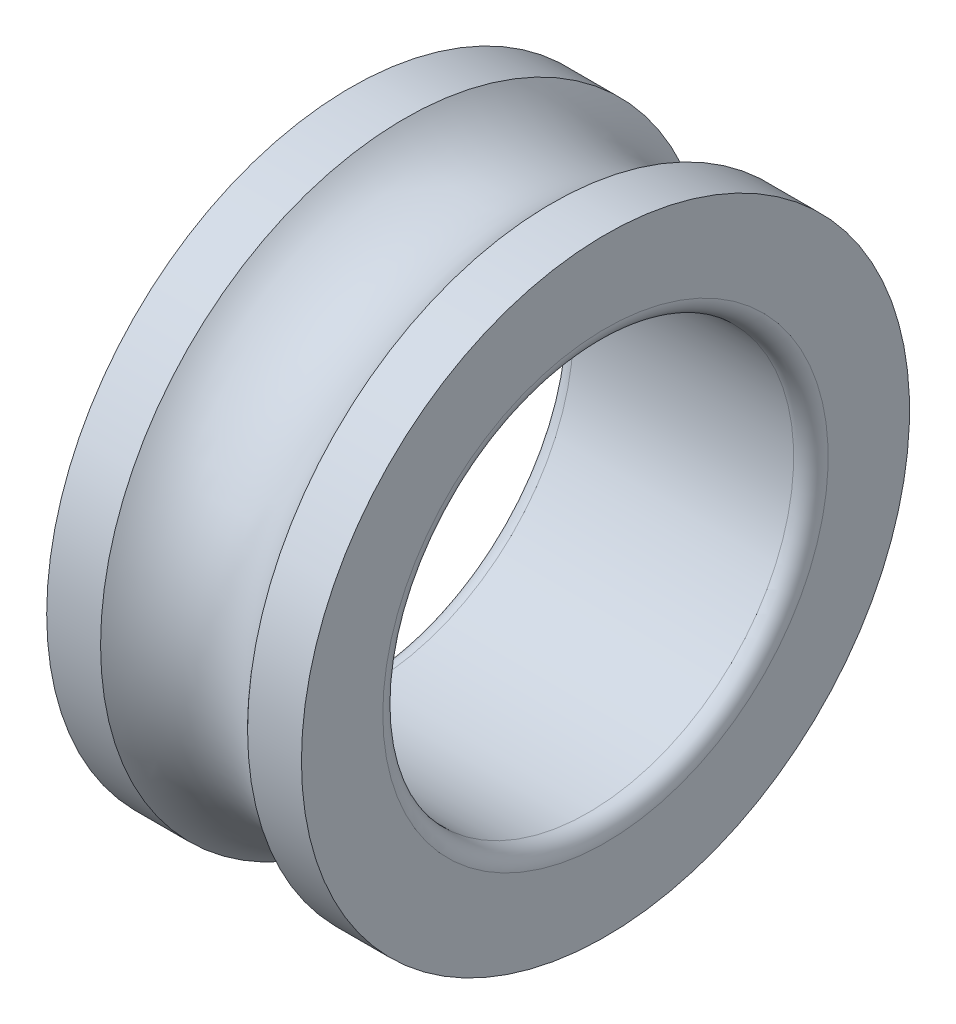
ISO-10303-21;
HEADER;
FILE_DESCRIPTION(('STEP AP214'),'2;1');
FILE_NAME('part.step','',(''),(''),'','','');
FILE_SCHEMA(('AUTOMOTIVE_DESIGN { 1 0 10303 214 1 1 1 1 }'));
ENDSEC;
DATA;
#1=APPLICATION_CONTEXT('core data for automotive mechanical design processes');
#2=APPLICATION_PROTOCOL_DEFINITION('international standard','automotive_design',2000,#1);
#3=PRODUCT_CONTEXT('',#1,'mechanical');
#4=PRODUCT('Part','Part','',(#3));
#5=PRODUCT_RELATED_PRODUCT_CATEGORY('part','',(#4));
#6=PRODUCT_DEFINITION_FORMATION('','',#4);
#7=PRODUCT_DEFINITION_CONTEXT('part definition',#1,'design');
#8=PRODUCT_DEFINITION('design','',#6,#7);
#9=PRODUCT_DEFINITION_SHAPE('','',#8);
#10=(LENGTH_UNIT() NAMED_UNIT(*) SI_UNIT(.MILLI.,.METRE.));
#11=(NAMED_UNIT(*) PLANE_ANGLE_UNIT() SI_UNIT($,.RADIAN.));
#12=(NAMED_UNIT(*) SI_UNIT($,.STERADIAN.) SOLID_ANGLE_UNIT());
#13=UNCERTAINTY_MEASURE_WITH_UNIT(LENGTH_MEASURE(1.E-05),#10,'distance_accuracy_value','');
#14=(GEOMETRIC_REPRESENTATION_CONTEXT(3) GLOBAL_UNCERTAINTY_ASSIGNED_CONTEXT((#13)) GLOBAL_UNIT_ASSIGNED_CONTEXT((#10,
#11,#12)) REPRESENTATION_CONTEXT('',''));
#15=CARTESIAN_POINT('',(0.,0.,0.));
#16=DIRECTION('',(0.,0.,1.));
#17=DIRECTION('',(1.,0.,0.));
#18=AXIS2_PLACEMENT_3D('',#15,#16,#17);
#19=CARTESIAN_POINT('',(-1.75058823529412,0.,0.));
#20=DIRECTION('',(-1.,0.,0.));
#21=DIRECTION('',(0.,0.,1.));
#22=AXIS2_PLACEMENT_3D('',#19,#20,#21);
#23=CYLINDRICAL_SURFACE('',#22,37.);
#24=CARTESIAN_POINT('',(-29.45,0.,0.));
#25=DIRECTION('',(-1.,0.,0.));
#26=DIRECTION('',(0.,0.,1.));
#27=AXIS2_PLACEMENT_3D('',#24,#25,#26);
#28=CIRCLE('',#27,37.);
#29=CARTESIAN_POINT('',(-29.45,0.,37.));
#30=VERTEX_POINT('',#29);
#31=EDGE_CURVE('E78',#30,#30,#28,.T.);
#32=ORIENTED_EDGE('',*,*,#31,.F.);
#33=EDGE_LOOP('',(#32));
#34=FACE_BOUND('',#33,.T.);
#35=CARTESIAN_POINT('',(-22.8942719099992,0.,0.));
#36=DIRECTION('',(-1.,0.,0.));
#37=DIRECTION('',(0.,0.,1.));
#38=AXIS2_PLACEMENT_3D('',#35,#36,#37);
#39=CIRCLE('',#38,37.);
#40=CARTESIAN_POINT('',(-22.8942719099992,0.,37.));
#41=VERTEX_POINT('',#40);
#42=EDGE_CURVE('E10',#41,#41,#39,.T.);
#43=ORIENTED_EDGE('',*,*,#42,.T.);
#44=EDGE_LOOP('',(#43));
#45=FACE_BOUND('',#44,.T.);
#46=ADVANCED_FACE('F43',(#34,#45),#23,.T.);
#47=CARTESIAN_POINT('',(-13.95,0.,0.));
#48=DIRECTION('',(-1.,0.,0.));
#49=DIRECTION('',(0.,0.,1.));
#50=AXIS2_PLACEMENT_3D('',#47,#48,#49);
#51=TOROIDAL_SURFACE('',#50,45.,12.);
#52=ORIENTED_EDGE('',*,*,#42,.F.);
#53=EDGE_LOOP('',(#52));
#54=FACE_BOUND('',#53,.T.);
#55=CARTESIAN_POINT('',(-5.00572809000085,0.,0.));
#56=DIRECTION('',(-1.,0.,0.));
#57=DIRECTION('',(0.,0.,1.));
#58=AXIS2_PLACEMENT_3D('',#55,#56,#57);
#59=CIRCLE('',#58,37.);
#60=CARTESIAN_POINT('',(-5.00572809000085,0.,37.));
#61=VERTEX_POINT('',#60);
#62=EDGE_CURVE('E50',#61,#61,#59,.T.);
#63=ORIENTED_EDGE('',*,*,#62,.T.);
#64=EDGE_LOOP('',(#63));
#65=FACE_BOUND('',#64,.T.);
#66=ADVANCED_FACE('F86',(#54,#65),#51,.F.);
#67=CARTESIAN_POINT('',(-1.75058823529412,0.,0.));
#68=DIRECTION('',(-1.,0.,0.));
#69=DIRECTION('',(0.,0.,1.));
#70=AXIS2_PLACEMENT_3D('',#67,#68,#69);
#71=CYLINDRICAL_SURFACE('',#70,37.);
#72=ORIENTED_EDGE('',*,*,#62,.F.);
#73=EDGE_LOOP('',(#72));
#74=FACE_BOUND('',#73,.T.);
#75=CARTESIAN_POINT('',(1.55,0.,0.));
#76=DIRECTION('',(-1.,0.,0.));
#77=DIRECTION('',(0.,0.,1.));
#78=AXIS2_PLACEMENT_3D('',#75,#76,#77);
#79=CIRCLE('',#78,37.);
#80=CARTESIAN_POINT('',(1.55,0.,37.));
#81=VERTEX_POINT('',#80);
#82=EDGE_CURVE('E55',#81,#81,#79,.T.);
#83=ORIENTED_EDGE('',*,*,#82,.T.);
#84=EDGE_LOOP('',(#83));
#85=FACE_BOUND('',#84,.T.);
#86=ADVANCED_FACE('F90',(#74,#85),#71,.T.);
#87=CARTESIAN_POINT('',(1.55,27.1,0.));
#88=DIRECTION('',(-1.,0.,0.));
#89=DIRECTION('',(0.,0.,1.));
#90=AXIS2_PLACEMENT_3D('',#87,#88,#89);
#91=PLANE('',#90);
#92=ORIENTED_EDGE('',*,*,#82,.F.);
#93=EDGE_LOOP('',(#92));
#94=FACE_BOUND('',#93,.T.);
#95=CARTESIAN_POINT('',(1.55,0.,0.));
#96=DIRECTION('',(-1.,0.,0.));
#97=DIRECTION('',(0.,0.,1.));
#98=AXIS2_PLACEMENT_3D('',#95,#96,#97);
#99=CIRCLE('',#98,27.1);
#100=CARTESIAN_POINT('',(1.55,0.,27.1));
#101=VERTEX_POINT('',#100);
#102=EDGE_CURVE('E60',#101,#101,#99,.T.);
#103=ORIENTED_EDGE('',*,*,#102,.T.);
#104=EDGE_LOOP('',(#103));
#105=FACE_BOUND('',#104,.T.);
#106=ADVANCED_FACE('F95',(#94,#105),#91,.F.);
#107=CARTESIAN_POINT('',(-0.55,0.,0.));
#108=DIRECTION('',(-1.,0.,0.));
#109=DIRECTION('',(0.,0.,1.));
#110=AXIS2_PLACEMENT_3D('',#107,#108,#109);
#111=TOROIDAL_SURFACE('',#110,27.1,2.1);
#112=ORIENTED_EDGE('',*,*,#102,.F.);
#113=EDGE_LOOP('',(#112));
#114=FACE_BOUND('',#113,.T.);
#115=CARTESIAN_POINT('',(-0.550000000000014,0.,0.));
#116=DIRECTION('',(-1.,0.,0.));
#117=DIRECTION('',(0.,0.,1.));
#118=AXIS2_PLACEMENT_3D('',#115,#116,#117);
#119=CIRCLE('',#118,25.);
#120=CARTESIAN_POINT('',(-0.550000000000014,0.,25.));
#121=VERTEX_POINT('',#120);
#122=EDGE_CURVE('E66',#121,#121,#119,.T.);
#123=ORIENTED_EDGE('',*,*,#122,.T.);
#124=EDGE_LOOP('',(#123));
#125=FACE_BOUND('',#124,.T.);
#126=ADVANCED_FACE('F101',(#114,#125),#111,.T.);
#127=CARTESIAN_POINT('',(-1.75058823529412,0.,0.));
#128=DIRECTION('',(-1.,0.,0.));
#129=DIRECTION('',(0.,0.,1.));
#130=AXIS2_PLACEMENT_3D('',#127,#128,#129);
#131=CYLINDRICAL_SURFACE('',#130,25.);
#132=ORIENTED_EDGE('',*,*,#122,.F.);
#133=EDGE_LOOP('',(#132));
#134=FACE_BOUND('',#133,.T.);
#135=CARTESIAN_POINT('',(-27.35,0.,0.));
#136=DIRECTION('',(-1.,0.,0.));
#137=DIRECTION('',(0.,0.,1.));
#138=AXIS2_PLACEMENT_3D('',#135,#136,#137);
#139=CIRCLE('',#138,25.);
#140=CARTESIAN_POINT('',(-27.35,0.,25.));
#141=VERTEX_POINT('',#140);
#142=EDGE_CURVE('E70',#141,#141,#139,.T.);
#143=ORIENTED_EDGE('',*,*,#142,.T.);
#144=EDGE_LOOP('',(#143));
#145=FACE_BOUND('',#144,.T.);
#146=ADVANCED_FACE('F105',(#134,#145),#131,.F.);
#147=CARTESIAN_POINT('',(-27.35,0.,0.));
#148=DIRECTION('',(-1.,0.,0.));
#149=DIRECTION('',(0.,0.,1.));
#150=AXIS2_PLACEMENT_3D('',#147,#148,#149);
#151=TOROIDAL_SURFACE('',#150,27.1,2.1);
#152=ORIENTED_EDGE('',*,*,#142,.F.);
#153=EDGE_LOOP('',(#152));
#154=FACE_BOUND('',#153,.T.);
#155=CARTESIAN_POINT('',(-29.45,0.,0.));
#156=DIRECTION('',(-1.,0.,0.));
#157=DIRECTION('',(0.,0.,1.));
#158=AXIS2_PLACEMENT_3D('',#155,#156,#157);
#159=CIRCLE('',#158,27.1);
#160=CARTESIAN_POINT('',(-29.45,0.,27.1));
#161=VERTEX_POINT('',#160);
#162=EDGE_CURVE('E74',#161,#161,#159,.T.);
#163=ORIENTED_EDGE('',*,*,#162,.T.);
#164=EDGE_LOOP('',(#163));
#165=FACE_BOUND('',#164,.T.);
#166=ADVANCED_FACE('F109',(#154,#165),#151,.T.);
#167=CARTESIAN_POINT('',(-29.45,27.1,0.));
#168=DIRECTION('',(1.,0.,0.));
#169=DIRECTION('',(0.,0.,-1.));
#170=AXIS2_PLACEMENT_3D('',#167,#168,#169);
#171=PLANE('',#170);
#172=ORIENTED_EDGE('',*,*,#162,.F.);
#173=EDGE_LOOP('',(#172));
#174=FACE_BOUND('',#173,.T.);
#175=ORIENTED_EDGE('',*,*,#31,.T.);
#176=EDGE_LOOP('',(#175));
#177=FACE_BOUND('',#176,.T.);
#178=ADVANCED_FACE('F83',(#174,#177),#171,.F.);
#179=CLOSED_SHELL('',(#46,#66,#86,#106,#126,#146,#166,#178));
#180=MANIFOLD_SOLID_BREP('B2',#179);
#181=ADVANCED_BREP_SHAPE_REPRESENTATION('',(#18,#180),#14);
#182=SHAPE_DEFINITION_REPRESENTATION(#9,#181);
ENDSEC;
END-ISO-10303-21;
